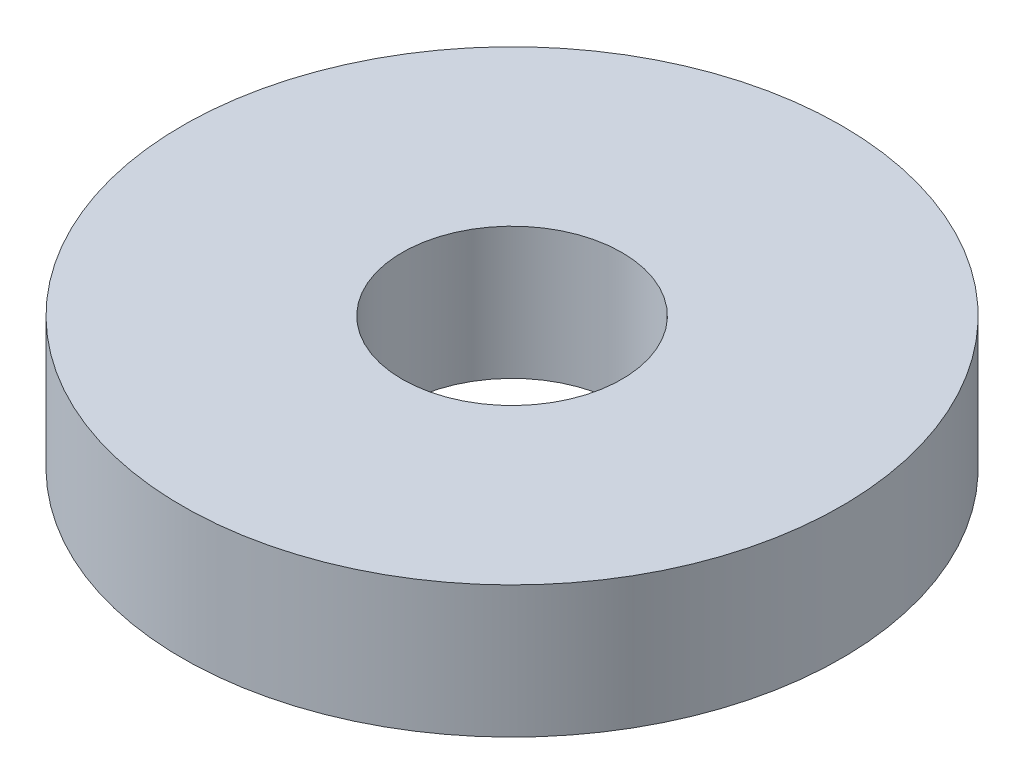
ISO-10303-21;
HEADER;
FILE_DESCRIPTION(('STEP AP214'),'2;1');
FILE_NAME('part.step','',(''),(''),'','','');
FILE_SCHEMA(('AUTOMOTIVE_DESIGN { 1 0 10303 214 1 1 1 1 }'));
ENDSEC;
DATA;
#1=APPLICATION_CONTEXT('core data for automotive mechanical design processes');
#2=APPLICATION_PROTOCOL_DEFINITION('international standard','automotive_design',2000,#1);
#3=PRODUCT_CONTEXT('',#1,'mechanical');
#4=PRODUCT('Part','Part','',(#3));
#5=PRODUCT_RELATED_PRODUCT_CATEGORY('part','',(#4));
#6=PRODUCT_DEFINITION_FORMATION('','',#4);
#7=PRODUCT_DEFINITION_CONTEXT('part definition',#1,'design');
#8=PRODUCT_DEFINITION('design','',#6,#7);
#9=PRODUCT_DEFINITION_SHAPE('','',#8);
#10=(LENGTH_UNIT() NAMED_UNIT(*) SI_UNIT(.MILLI.,.METRE.));
#11=(NAMED_UNIT(*) PLANE_ANGLE_UNIT() SI_UNIT($,.RADIAN.));
#12=(NAMED_UNIT(*) SI_UNIT($,.STERADIAN.) SOLID_ANGLE_UNIT());
#13=UNCERTAINTY_MEASURE_WITH_UNIT(LENGTH_MEASURE(1.E-05),#10,'distance_accuracy_value','');
#14=(GEOMETRIC_REPRESENTATION_CONTEXT(3) GLOBAL_UNCERTAINTY_ASSIGNED_CONTEXT((#13)) GLOBAL_UNIT_ASSIGNED_CONTEXT((#10,
#11,#12)) REPRESENTATION_CONTEXT('',''));
#15=CARTESIAN_POINT('',(0.,0.,0.));
#16=DIRECTION('',(0.,0.,1.));
#17=DIRECTION('',(1.,0.,0.));
#18=AXIS2_PLACEMENT_3D('',#15,#16,#17);
#19=CARTESIAN_POINT('',(0.,0.,0.));
#20=DIRECTION('',(0.,-1.,0.));
#21=DIRECTION('',(0.,0.,-1.));
#22=AXIS2_PLACEMENT_3D('',#19,#20,#21);
#23=CYLINDRICAL_SURFACE('',#22,5.);
#24=CARTESIAN_POINT('',(0.,3.0671845574388,0.));
#25=DIRECTION('',(0.,-1.,0.));
#26=DIRECTION('',(0.,0.,-1.));
#27=AXIS2_PLACEMENT_3D('',#24,#25,#26);
#28=CIRCLE('',#27,5.);
#29=CARTESIAN_POINT('',(0.,3.0671845574388,-5.));
#30=VERTEX_POINT('',#29);
#31=EDGE_CURVE('E49',#30,#30,#28,.T.);
#32=ORIENTED_EDGE('',*,*,#31,.F.);
#33=EDGE_LOOP('',(#32));
#34=FACE_BOUND('',#33,.T.);
#35=CARTESIAN_POINT('',(0.,-2.9328154425612,0.));
#36=DIRECTION('',(0.,-1.,0.));
#37=DIRECTION('',(0.,0.,-1.));
#38=AXIS2_PLACEMENT_3D('',#35,#36,#37);
#39=CIRCLE('',#38,5.);
#40=CARTESIAN_POINT('',(0.,-2.9328154425612,-5.));
#41=VERTEX_POINT('',#40);
#42=EDGE_CURVE('E10',#41,#41,#39,.T.);
#43=ORIENTED_EDGE('',*,*,#42,.T.);
#44=EDGE_LOOP('',(#43));
#45=FACE_BOUND('',#44,.T.);
#46=ADVANCED_FACE('F35',(#34,#45),#23,.F.);
#47=CARTESIAN_POINT('',(-5.,-2.9328154425612,0.));
#48=DIRECTION('',(0.,1.,0.));
#49=DIRECTION('',(0.,0.,1.));
#50=AXIS2_PLACEMENT_3D('',#47,#48,#49);
#51=PLANE('',#50);
#52=ORIENTED_EDGE('',*,*,#42,.F.);
#53=EDGE_LOOP('',(#52));
#54=FACE_BOUND('',#53,.T.);
#55=CARTESIAN_POINT('',(0.,-2.9328154425612,0.));
#56=DIRECTION('',(0.,-1.,0.));
#57=DIRECTION('',(0.,0.,-1.));
#58=AXIS2_PLACEMENT_3D('',#55,#56,#57);
#59=CIRCLE('',#58,15.);
#60=CARTESIAN_POINT('',(0.,-2.9328154425612,-15.));
#61=VERTEX_POINT('',#60);
#62=EDGE_CURVE('E41',#61,#61,#59,.T.);
#63=ORIENTED_EDGE('',*,*,#62,.T.);
#64=EDGE_LOOP('',(#63));
#65=FACE_BOUND('',#64,.T.);
#66=ADVANCED_FACE('F58',(#54,#65),#51,.F.);
#67=CARTESIAN_POINT('',(0.,0.,0.));
#68=DIRECTION('',(0.,-1.,0.));
#69=DIRECTION('',(0.,0.,-1.));
#70=AXIS2_PLACEMENT_3D('',#67,#68,#69);
#71=CYLINDRICAL_SURFACE('',#70,15.);
#72=ORIENTED_EDGE('',*,*,#62,.F.);
#73=EDGE_LOOP('',(#72));
#74=FACE_BOUND('',#73,.T.);
#75=CARTESIAN_POINT('',(0.,3.0671845574388,0.));
#76=DIRECTION('',(0.,-1.,0.));
#77=DIRECTION('',(0.,0.,-1.));
#78=AXIS2_PLACEMENT_3D('',#75,#76,#77);
#79=CIRCLE('',#78,15.);
#80=CARTESIAN_POINT('',(0.,3.0671845574388,-15.));
#81=VERTEX_POINT('',#80);
#82=EDGE_CURVE('E45',#81,#81,#79,.T.);
#83=ORIENTED_EDGE('',*,*,#82,.T.);
#84=EDGE_LOOP('',(#83));
#85=FACE_BOUND('',#84,.T.);
#86=ADVANCED_FACE('F62',(#74,#85),#71,.T.);
#87=CARTESIAN_POINT('',(-5.,3.0671845574388,0.));
#88=DIRECTION('',(0.,-1.,0.));
#89=DIRECTION('',(0.,0.,-1.));
#90=AXIS2_PLACEMENT_3D('',#87,#88,#89);
#91=PLANE('',#90);
#92=ORIENTED_EDGE('',*,*,#82,.F.);
#93=EDGE_LOOP('',(#92));
#94=FACE_BOUND('',#93,.T.);
#95=ORIENTED_EDGE('',*,*,#31,.T.);
#96=EDGE_LOOP('',(#95));
#97=FACE_BOUND('',#96,.T.);
#98=ADVANCED_FACE('F55',(#94,#97),#91,.F.);
#99=CLOSED_SHELL('',(#46,#66,#86,#98));
#100=MANIFOLD_SOLID_BREP('B2',#99);
#101=ADVANCED_BREP_SHAPE_REPRESENTATION('',(#18,#100),#14);
#102=SHAPE_DEFINITION_REPRESENTATION(#9,#101);
ENDSEC;
END-ISO-10303-21;
